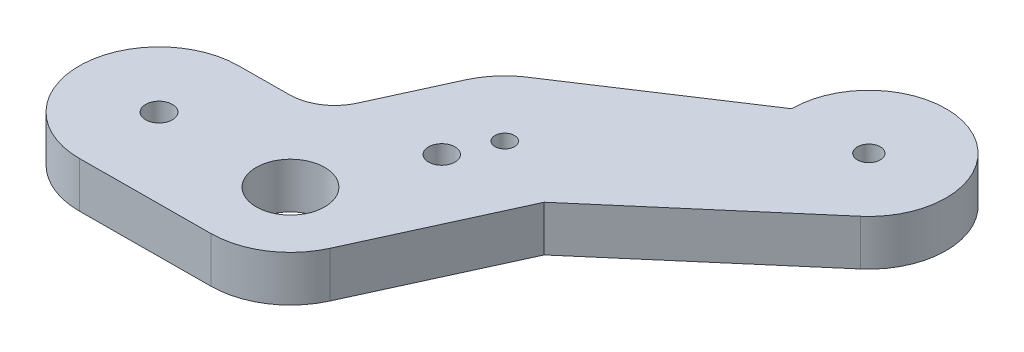
ISO-10303-21;
HEADER;
FILE_DESCRIPTION(('STEP AP214'),'2;1');
FILE_NAME('part.step','',(''),(''),'','','');
FILE_SCHEMA(('AUTOMOTIVE_DESIGN { 1 0 10303 214 1 1 1 1 }'));
ENDSEC;
DATA;
#1=APPLICATION_CONTEXT('core data for automotive mechanical design processes');
#2=APPLICATION_PROTOCOL_DEFINITION('international standard','automotive_design',2000,#1);
#3=PRODUCT_CONTEXT('',#1,'mechanical');
#4=PRODUCT('Part','Part','',(#3));
#5=PRODUCT_RELATED_PRODUCT_CATEGORY('part','',(#4));
#6=PRODUCT_DEFINITION_FORMATION('','',#4);
#7=PRODUCT_DEFINITION_CONTEXT('part definition',#1,'design');
#8=PRODUCT_DEFINITION('design','',#6,#7);
#9=PRODUCT_DEFINITION_SHAPE('','',#8);
#10=(LENGTH_UNIT() NAMED_UNIT(*) SI_UNIT(.MILLI.,.METRE.));
#11=(NAMED_UNIT(*) PLANE_ANGLE_UNIT() SI_UNIT($,.RADIAN.));
#12=(NAMED_UNIT(*) SI_UNIT($,.STERADIAN.) SOLID_ANGLE_UNIT());
#13=UNCERTAINTY_MEASURE_WITH_UNIT(LENGTH_MEASURE(1.E-05),#10,'distance_accuracy_value','');
#14=(GEOMETRIC_REPRESENTATION_CONTEXT(3) GLOBAL_UNCERTAINTY_ASSIGNED_CONTEXT((#13)) GLOBAL_UNIT_ASSIGNED_CONTEXT((#10,
#11,#12)) REPRESENTATION_CONTEXT('',''));
#15=CARTESIAN_POINT('',(0.,0.,0.));
#16=DIRECTION('',(0.,0.,1.));
#17=DIRECTION('',(1.,0.,0.));
#18=AXIS2_PLACEMENT_3D('',#15,#16,#17);
#19=CARTESIAN_POINT('',(-5.72459988362683,2.,0.0323685502486947));
#20=DIRECTION('',(0.,1.,0.));
#21=DIRECTION('',(0.,0.,1.));
#22=AXIS2_PLACEMENT_3D('',#19,#20,#21);
#23=PLANE('',#22);
#24=DIRECTION('',(0.415791867421865,0.,-0.909459797344467));
#25=VECTOR('',#24,1.);
#26=CARTESIAN_POINT('',(6.12746518713403,2.,-4.98490569374996));
#27=LINE('',#26,#25);
#28=CARTESIAN_POINT('',(3.18310929070563,2.,1.45527153597653));
#29=VERTEX_POINT('',#28);
#30=CARTESIAN_POINT('',(6.12746518713402,2.,-4.98490569374996));
#31=VERTEX_POINT('',#30);
#32=EDGE_CURVE('E153',#29,#31,#27,.T.);
#33=ORIENTED_EDGE('',*,*,#32,.T.);
#34=DIRECTION('',(0.759237589921315,0.,-0.650813553984913));
#35=VECTOR('',#34,1.);
#36=CARTESIAN_POINT('',(13.5833894470859,2.,-11.3760757705167));
#37=LINE('',#36,#35);
#38=CARTESIAN_POINT('',(13.5833894470859,2.,-11.3760757705167));
#39=VERTEX_POINT('',#38);
#40=EDGE_CURVE('E135',#31,#39,#37,.T.);
#41=ORIENTED_EDGE('',*,*,#40,.T.);
#42=CARTESIAN_POINT('',(11.3810751490046,2.,-13.9452905474468));
#43=DIRECTION('',(0.,1.,0.));
#44=DIRECTION('',(0.,0.,1.));
#45=AXIS2_PLACEMENT_3D('',#42,#43,#44);
#46=CIRCLE('',#45,3.3839404305527);
#47=CARTESIAN_POINT('',(7.99713471845192,2.,-13.9452905474468));
#48=VERTEX_POINT('',#47);
#49=EDGE_CURVE('E145',#39,#48,#46,.T.);
#50=ORIENTED_EDGE('',*,*,#49,.T.);
#51=DIRECTION('',(-0.835586663594744,0.,0.549358651176628));
#52=VECTOR('',#51,1.);
#53=CARTESIAN_POINT('',(7.99713471845192,2.,-13.9452905474468));
#54=LINE('',#53,#52);
#55=CARTESIAN_POINT('',(1.17427403814456,2.,-9.45958283596333));
#56=VERTEX_POINT('',#55);
#57=EDGE_CURVE('E142',#48,#56,#54,.T.);
#58=ORIENTED_EDGE('',*,*,#57,.T.);
#59=CARTESIAN_POINT('',(1.17427403814456,2.,-9.45958283596333));
#60=DIRECTION('',(-0.835586663594743,0.,0.549358651176629));
#61=VECTOR('',#60,1.);
#62=LINE('',#59,#61);
#63=CARTESIAN_POINT('',(0.873997954056209,2.,-9.26216553417717));
#64=VERTEX_POINT('',#63);
#65=EDGE_CURVE('E11',#56,#64,#62,.T.);
#66=ORIENTED_EDGE('',*,*,#65,.T.);
#67=CARTESIAN_POINT('',(2.94435589642839,2.,-6.44017722972649));
#68=DIRECTION('',(0.,1.,0.));
#69=DIRECTION('',(0.,0.,1.));
#70=AXIS2_PLACEMENT_3D('',#67,#68,#69);
#71=CIRCLE('',#70,3.5);
#72=CARTESIAN_POINT('',(-0.23875339427724,2.,-7.89544876570302));
#73=VERTEX_POINT('',#72);
#74=EDGE_CURVE('E275',#64,#73,#71,.T.);
#75=ORIENTED_EDGE('',*,*,#74,.T.);
#76=DIRECTION('',(-0.415791867421866,0.,0.909459797344466));
#77=VECTOR('',#76,1.);
#78=CARTESIAN_POINT('',(-1.72322244007623,2.,-4.64847588494993));
#79=LINE('',#78,#77);
#80=CARTESIAN_POINT('',(-1.72322244007623,2.,-4.64847588494993));
#81=VERTEX_POINT('',#80);
#82=EDGE_CURVE('E272',#73,#81,#79,.T.);
#83=ORIENTED_EDGE('',*,*,#82,.T.);
#84=CARTESIAN_POINT('',(-3.54214203476516,2.,-5.48005961979366));
#85=DIRECTION('',(0.,-1.,0.));
#86=DIRECTION('',(0.,0.,-1.));
#87=AXIS2_PLACEMENT_3D('',#84,#85,#86);
#88=CIRCLE('',#87,2.);
#89=CARTESIAN_POINT('',(-3.5308336347052,2.,-3.48009159002716));
#90=VERTEX_POINT('',#89);
#91=EDGE_CURVE('E269',#81,#90,#88,.T.);
#92=ORIENTED_EDGE('',*,*,#91,.T.);
#93=DIRECTION('',(-0.999984014883249,0.,0.00565420002998162));
#94=VECTOR('',#93,1.);
#95=CARTESIAN_POINT('',(-5.74438958373176,2.,-3.46757550184268));
#96=LINE('',#95,#94);
#97=CARTESIAN_POINT('',(-5.74438958373176,2.,-3.46757550184268));
#98=VERTEX_POINT('',#97);
#99=EDGE_CURVE('E211',#90,#98,#96,.T.);
#100=ORIENTED_EDGE('',*,*,#99,.T.);
#101=CARTESIAN_POINT('',(-5.72459988362683,2.,0.0323685502486947));
#102=DIRECTION('',(0.,1.,0.));
#103=DIRECTION('',(0.,0.,1.));
#104=AXIS2_PLACEMENT_3D('',#101,#102,#103);
#105=CIRCLE('',#104,3.5);
#106=CARTESIAN_POINT('',(-5.70481018352189,2.,3.53231260234007));
#107=VERTEX_POINT('',#106);
#108=EDGE_CURVE('E205',#98,#107,#105,.T.);
#109=ORIENTED_EDGE('',*,*,#108,.T.);
#110=DIRECTION('',(0.999984014883249,0.,-0.00565420002998246));
#111=VECTOR('',#110,1.);
#112=CARTESIAN_POINT('',(-5.70481018352189,2.,3.53231260234007));
#113=LINE('',#112,#111);
#114=CARTESIAN_POINT('',(0.0197897001049382,2.,3.49994405209137));
#115=VERTEX_POINT('',#114);
#116=EDGE_CURVE('E339',#107,#115,#113,.T.);
#117=ORIENTED_EDGE('',*,*,#116,.T.);
#118=CARTESIAN_POINT('',(0.,2.,0.));
#119=DIRECTION('',(0.,1.,0.));
#120=DIRECTION('',(0.,0.,1.));
#121=AXIS2_PLACEMENT_3D('',#118,#119,#120);
#122=CIRCLE('',#121,3.5);
#123=EDGE_CURVE('E337',#115,#29,#122,.T.);
#124=ORIENTED_EDGE('',*,*,#123,.T.);
#125=EDGE_LOOP('',(#33,#41,#50,#58,#66,#75,#83,#92,#100,#109,#117,#124));
#126=FACE_BOUND('',#125,.T.);
#127=CARTESIAN_POINT('',(2.07373006433971,2.,-4.55137824127935));
#128=DIRECTION('',(0.,1.,0.));
#129=DIRECTION('',(0.,0.,1.));
#130=AXIS2_PLACEMENT_3D('',#127,#128,#129);
#131=CIRCLE('',#130,0.579621875226505);
#132=CARTESIAN_POINT('',(2.07373006433971,2.,-3.97175636605285));
#133=VERTEX_POINT('',#132);
#134=EDGE_CURVE('E170',#133,#133,#131,.T.);
#135=ORIENTED_EDGE('',*,*,#134,.F.);
#136=EDGE_LOOP('',(#135));
#137=FACE_BOUND('',#136,.T.);
#138=CARTESIAN_POINT('',(2.94435589642839,2.,-6.44017722972649));
#139=DIRECTION('',(0.,1.,0.));
#140=DIRECTION('',(0.,0.,1.));
#141=AXIS2_PLACEMENT_3D('',#138,#139,#140);
#142=CIRCLE('',#141,0.425857630056519);
#143=CARTESIAN_POINT('',(2.94435589642839,2.,-6.01431959966997));
#144=VERTEX_POINT('',#143);
#145=EDGE_CURVE('E351',#144,#144,#142,.T.);
#146=ORIENTED_EDGE('',*,*,#145,.F.);
#147=EDGE_LOOP('',(#146));
#148=FACE_BOUND('',#147,.T.);
#149=CARTESIAN_POINT('',(0.,2.,0.));
#150=DIRECTION('',(0.,1.,0.));
#151=DIRECTION('',(0.,0.,1.));
#152=AXIS2_PLACEMENT_3D('',#149,#150,#151);
#153=CIRCLE('',#152,1.5);
#154=CARTESIAN_POINT('',(0.,2.,1.5));
#155=VERTEX_POINT('',#154);
#156=EDGE_CURVE('E266',#155,#155,#153,.T.);
#157=ORIENTED_EDGE('',*,*,#156,.F.);
#158=EDGE_LOOP('',(#157));
#159=FACE_BOUND('',#158,.T.);
#160=CARTESIAN_POINT('',(-5.72459988362683,2.,0.0323685502486947));
#161=DIRECTION('',(0.,1.,0.));
#162=DIRECTION('',(0.,0.,1.));
#163=AXIS2_PLACEMENT_3D('',#160,#161,#162);
#164=CIRCLE('',#163,0.586127488486837);
#165=CARTESIAN_POINT('',(-5.72459988362683,2.,0.618496038735532));
#166=VERTEX_POINT('',#165);
#167=EDGE_CURVE('E359',#166,#166,#164,.T.);
#168=ORIENTED_EDGE('',*,*,#167,.F.);
#169=EDGE_LOOP('',(#168));
#170=FACE_BOUND('',#169,.T.);
#171=CARTESIAN_POINT('',(11.3810751490046,2.,-13.9452905474468));
#172=DIRECTION('',(0.,1.,0.));
#173=DIRECTION('',(0.,0.,1.));
#174=AXIS2_PLACEMENT_3D('',#171,#172,#173);
#175=CIRCLE('',#174,0.499999999999995);
#176=CARTESIAN_POINT('',(11.3810751490046,2.,-13.4452905474468));
#177=VERTEX_POINT('',#176);
#178=EDGE_CURVE('E156',#177,#177,#175,.T.);
#179=ORIENTED_EDGE('',*,*,#178,.F.);
#180=EDGE_LOOP('',(#179));
#181=FACE_BOUND('',#180,.T.);
#182=ADVANCED_FACE('F39',(#126,#137,#148,#159,#170,#181),#23,.T.);
#183=CARTESIAN_POINT('',(-5.72459988362683,0.,0.0323685502486947));
#184=DIRECTION('',(0.,1.,0.));
#185=DIRECTION('',(0.,0.,1.));
#186=AXIS2_PLACEMENT_3D('',#183,#184,#185);
#187=PLANE('',#186);
#188=CARTESIAN_POINT('',(2.07373006433971,0.,-4.55137824127935));
#189=DIRECTION('',(0.,1.,0.));
#190=DIRECTION('',(0.,0.,1.));
#191=AXIS2_PLACEMENT_3D('',#188,#189,#190);
#192=CIRCLE('',#191,0.579621875226505);
#193=CARTESIAN_POINT('',(2.07373006433971,0.,-3.97175636605285));
#194=VERTEX_POINT('',#193);
#195=EDGE_CURVE('E367',#194,#194,#192,.F.);
#196=ORIENTED_EDGE('',*,*,#195,.F.);
#197=EDGE_LOOP('',(#196));
#198=FACE_BOUND('',#197,.T.);
#199=CARTESIAN_POINT('',(2.94435589642839,0.,-6.44017722972649));
#200=DIRECTION('',(0.,1.,0.));
#201=DIRECTION('',(0.,0.,1.));
#202=AXIS2_PLACEMENT_3D('',#199,#200,#201);
#203=CIRCLE('',#202,3.5);
#204=CARTESIAN_POINT('',(0.873997954056177,0.,-9.26216553417715));
#205=VERTEX_POINT('',#204);
#206=CARTESIAN_POINT('',(-0.23875339427724,0.,-7.89544876570302));
#207=VERTEX_POINT('',#206);
#208=EDGE_CURVE('E185',#205,#207,#203,.T.);
#209=ORIENTED_EDGE('',*,*,#208,.F.);
#210=CARTESIAN_POINT('',(2.94435589642839,0.,-6.44017722972649));
#211=DIRECTION('',(0.,1.,0.));
#212=DIRECTION('',(-0.505737673795381,0.,-0.862687316067668));
#213=AXIS2_PLACEMENT_3D('',#210,#211,#212);
#214=CIRCLE('',#213,3.5);
#215=CARTESIAN_POINT('',(1.17427403814456,0.,-9.45958283596333));
#216=VERTEX_POINT('',#215);
#217=EDGE_CURVE('E51',#216,#205,#214,.T.);
#218=ORIENTED_EDGE('',*,*,#217,.F.);
#219=DIRECTION('',(0.835586663594744,0.,-0.549358651176628));
#220=VECTOR('',#219,1.);
#221=CARTESIAN_POINT('',(7.99713471845192,0.,-13.9452905474468));
#222=LINE('',#221,#220);
#223=CARTESIAN_POINT('',(7.99713471845192,0.,-13.9452905474468));
#224=VERTEX_POINT('',#223);
#225=EDGE_CURVE('E173',#216,#224,#222,.T.);
#226=ORIENTED_EDGE('',*,*,#225,.T.);
#227=CARTESIAN_POINT('',(11.3810751490046,0.,-13.9452905474468));
#228=DIRECTION('',(0.,1.,0.));
#229=DIRECTION('',(0.,0.,1.));
#230=AXIS2_PLACEMENT_3D('',#227,#228,#229);
#231=CIRCLE('',#230,3.3839404305527);
#232=CARTESIAN_POINT('',(13.5833894470859,0.,-11.3760757705167));
#233=VERTEX_POINT('',#232);
#234=EDGE_CURVE('E164',#224,#233,#231,.F.);
#235=ORIENTED_EDGE('',*,*,#234,.T.);
#236=DIRECTION('',(-0.759237589921315,0.,0.650813553984913));
#237=VECTOR('',#236,1.);
#238=CARTESIAN_POINT('',(13.5833894470859,0.,-11.3760757705167));
#239=LINE('',#238,#237);
#240=CARTESIAN_POINT('',(6.12746518713402,0.,-4.98490569374996));
#241=VERTEX_POINT('',#240);
#242=EDGE_CURVE('E137',#233,#241,#239,.T.);
#243=ORIENTED_EDGE('',*,*,#242,.T.);
#244=DIRECTION('',(0.415791867421865,0.,-0.909459797344467));
#245=VECTOR('',#244,1.);
#246=CARTESIAN_POINT('',(6.12746518713403,0.,-4.98490569374996));
#247=LINE('',#246,#245);
#248=CARTESIAN_POINT('',(3.18310929070563,0.,1.45527153597653));
#249=VERTEX_POINT('',#248);
#250=EDGE_CURVE('E190',#249,#241,#247,.T.);
#251=ORIENTED_EDGE('',*,*,#250,.F.);
#252=CARTESIAN_POINT('',(0.,0.,0.));
#253=DIRECTION('',(0.,1.,0.));
#254=DIRECTION('',(0.,0.,1.));
#255=AXIS2_PLACEMENT_3D('',#252,#253,#254);
#256=CIRCLE('',#255,3.5);
#257=CARTESIAN_POINT('',(0.0197897001049382,0.,3.49994405209137));
#258=VERTEX_POINT('',#257);
#259=EDGE_CURVE('E255',#258,#249,#256,.T.);
#260=ORIENTED_EDGE('',*,*,#259,.F.);
#261=DIRECTION('',(0.999984014883249,0.,-0.00565420002998246));
#262=VECTOR('',#261,1.);
#263=CARTESIAN_POINT('',(-5.70481018352189,0.,3.53231260234007));
#264=LINE('',#263,#262);
#265=CARTESIAN_POINT('',(-5.70481018352189,0.,3.53231260234007));
#266=VERTEX_POINT('',#265);
#267=EDGE_CURVE('E257',#266,#258,#264,.T.);
#268=ORIENTED_EDGE('',*,*,#267,.F.);
#269=CARTESIAN_POINT('',(-5.72459988362683,0.,0.0323685502486947));
#270=DIRECTION('',(0.,1.,0.));
#271=DIRECTION('',(0.,0.,1.));
#272=AXIS2_PLACEMENT_3D('',#269,#270,#271);
#273=CIRCLE('',#272,3.5);
#274=CARTESIAN_POINT('',(-5.74438958373176,0.,-3.46757550184268));
#275=VERTEX_POINT('',#274);
#276=EDGE_CURVE('E260',#275,#266,#273,.T.);
#277=ORIENTED_EDGE('',*,*,#276,.F.);
#278=DIRECTION('',(-0.999984014883249,0.,0.00565420002998162));
#279=VECTOR('',#278,1.);
#280=CARTESIAN_POINT('',(-5.74438958373176,0.,-3.46757550184268));
#281=LINE('',#280,#279);
#282=CARTESIAN_POINT('',(-3.5308336347052,0.,-3.48009159002716));
#283=VERTEX_POINT('',#282);
#284=EDGE_CURVE('E202',#283,#275,#281,.T.);
#285=ORIENTED_EDGE('',*,*,#284,.F.);
#286=CARTESIAN_POINT('',(-3.54214203476516,0.,-5.48005961979366));
#287=DIRECTION('',(0.,-1.,0.));
#288=DIRECTION('',(0.,0.,-1.));
#289=AXIS2_PLACEMENT_3D('',#286,#287,#288);
#290=CIRCLE('',#289,2.);
#291=CARTESIAN_POINT('',(-1.72322244007623,0.,-4.64847588494993));
#292=VERTEX_POINT('',#291);
#293=EDGE_CURVE('E199',#292,#283,#290,.T.);
#294=ORIENTED_EDGE('',*,*,#293,.F.);
#295=DIRECTION('',(-0.415791867421866,0.,0.909459797344466));
#296=VECTOR('',#295,1.);
#297=CARTESIAN_POINT('',(-1.72322244007623,0.,-4.64847588494993));
#298=LINE('',#297,#296);
#299=EDGE_CURVE('E189',#207,#292,#298,.T.);
#300=ORIENTED_EDGE('',*,*,#299,.F.);
#301=EDGE_LOOP('',(#209,#218,#226,#235,#243,#251,#260,#268,#277,#285,#294,#300));
#302=FACE_BOUND('',#301,.T.);
#303=CARTESIAN_POINT('',(0.,0.,0.));
#304=DIRECTION('',(0.,1.,0.));
#305=DIRECTION('',(0.,0.,1.));
#306=AXIS2_PLACEMENT_3D('',#303,#304,#305);
#307=CIRCLE('',#306,1.5);
#308=CARTESIAN_POINT('',(0.,0.,1.5));
#309=VERTEX_POINT('',#308);
#310=EDGE_CURVE('E347',#309,#309,#307,.T.);
#311=ORIENTED_EDGE('',*,*,#310,.T.);
#312=EDGE_LOOP('',(#311));
#313=FACE_BOUND('',#312,.T.);
#314=CARTESIAN_POINT('',(2.94435589642839,0.,-6.44017722972649));
#315=DIRECTION('',(0.,1.,0.));
#316=DIRECTION('',(0.,0.,1.));
#317=AXIS2_PLACEMENT_3D('',#314,#315,#316);
#318=CIRCLE('',#317,0.425857630056519);
#319=CARTESIAN_POINT('',(2.94435589642839,0.,-6.01431959966997));
#320=VERTEX_POINT('',#319);
#321=EDGE_CURVE('E355',#320,#320,#318,.T.);
#322=ORIENTED_EDGE('',*,*,#321,.T.);
#323=EDGE_LOOP('',(#322));
#324=FACE_BOUND('',#323,.T.);
#325=CARTESIAN_POINT('',(-5.72459988362683,0.,0.0323685502486947));
#326=DIRECTION('',(0.,1.,0.));
#327=DIRECTION('',(0.,0.,1.));
#328=AXIS2_PLACEMENT_3D('',#325,#326,#327);
#329=CIRCLE('',#328,0.586127488486837);
#330=CARTESIAN_POINT('',(-5.72459988362683,0.,0.618496038735532));
#331=VERTEX_POINT('',#330);
#332=EDGE_CURVE('E363',#331,#331,#329,.T.);
#333=ORIENTED_EDGE('',*,*,#332,.T.);
#334=EDGE_LOOP('',(#333));
#335=FACE_BOUND('',#334,.T.);
#336=CARTESIAN_POINT('',(11.3810751490046,0.,-13.9452905474468));
#337=DIRECTION('',(0.,1.,0.));
#338=DIRECTION('',(0.,0.,1.));
#339=AXIS2_PLACEMENT_3D('',#336,#337,#338);
#340=CIRCLE('',#339,0.499999999999995);
#341=CARTESIAN_POINT('',(11.3810751490046,0.,-13.4452905474468));
#342=VERTEX_POINT('',#341);
#343=EDGE_CURVE('E166',#342,#342,#340,.F.);
#344=ORIENTED_EDGE('',*,*,#343,.F.);
#345=EDGE_LOOP('',(#344));
#346=FACE_BOUND('',#345,.T.);
#347=ADVANCED_FACE('F239',(#198,#302,#313,#324,#335,#346),#187,.F.);
#348=CARTESIAN_POINT('',(-5.72459988362683,2.,0.0323685502486947));
#349=DIRECTION('',(0.,-1.,0.));
#350=DIRECTION('',(0.,0.,-1.));
#351=AXIS2_PLACEMENT_3D('',#348,#349,#350);
#352=CYLINDRICAL_SURFACE('',#351,3.5);
#353=ORIENTED_EDGE('',*,*,#276,.T.);
#354=DIRECTION('',(0.,-1.,0.));
#355=VECTOR('',#354,1.);
#356=CARTESIAN_POINT('',(-5.70481018352189,2.,3.53231260234007));
#357=LINE('',#356,#355);
#358=EDGE_CURVE('E180',#107,#266,#357,.T.);
#359=ORIENTED_EDGE('',*,*,#358,.F.);
#360=ORIENTED_EDGE('',*,*,#108,.F.);
#361=DIRECTION('',(0.,-1.,0.));
#362=VECTOR('',#361,1.);
#363=CARTESIAN_POINT('',(-5.74438958373176,2.,-3.46757550184268));
#364=LINE('',#363,#362);
#365=EDGE_CURVE('E206',#98,#275,#364,.T.);
#366=ORIENTED_EDGE('',*,*,#365,.T.);
#367=EDGE_LOOP('',(#353,#359,#360,#366));
#368=FACE_BOUND('',#367,.T.);
#369=ADVANCED_FACE('F41',(#368),#352,.T.);
#370=CARTESIAN_POINT('',(-5.70481018352189,2.,3.53231260234007));
#371=DIRECTION('',(-0.00565420002998246,0.,-0.999984014883249));
#372=DIRECTION('',(-0.999984014883249,0.,0.00565420002998246));
#373=AXIS2_PLACEMENT_3D('',#370,#371,#372);
#374=PLANE('',#373);
#375=ORIENTED_EDGE('',*,*,#267,.T.);
#376=DIRECTION('',(0.,-1.,0.));
#377=VECTOR('',#376,1.);
#378=CARTESIAN_POINT('',(0.0197897001049382,2.,3.49994405209137));
#379=LINE('',#378,#377);
#380=EDGE_CURVE('E230',#115,#258,#379,.T.);
#381=ORIENTED_EDGE('',*,*,#380,.F.);
#382=ORIENTED_EDGE('',*,*,#116,.F.);
#383=ORIENTED_EDGE('',*,*,#358,.T.);
#384=EDGE_LOOP('',(#375,#381,#382,#383));
#385=FACE_BOUND('',#384,.T.);
#386=ADVANCED_FACE('F326',(#385),#374,.F.);
#387=CARTESIAN_POINT('',(0.,2.,0.));
#388=DIRECTION('',(0.,-1.,0.));
#389=DIRECTION('',(0.,0.,-1.));
#390=AXIS2_PLACEMENT_3D('',#387,#388,#389);
#391=CYLINDRICAL_SURFACE('',#390,3.5);
#392=ORIENTED_EDGE('',*,*,#259,.T.);
#393=DIRECTION('',(0.,-1.,0.));
#394=VECTOR('',#393,1.);
#395=CARTESIAN_POINT('',(3.18310929070563,2.,1.45527153597653));
#396=LINE('',#395,#394);
#397=EDGE_CURVE('E226',#29,#249,#396,.T.);
#398=ORIENTED_EDGE('',*,*,#397,.F.);
#399=ORIENTED_EDGE('',*,*,#123,.F.);
#400=ORIENTED_EDGE('',*,*,#380,.T.);
#401=EDGE_LOOP('',(#392,#398,#399,#400));
#402=FACE_BOUND('',#401,.T.);
#403=ADVANCED_FACE('F324',(#402),#391,.T.);
#404=CARTESIAN_POINT('',(6.12746518713403,2.,-4.98490569374996));
#405=DIRECTION('',(-0.909459797344467,0.,-0.415791867421865));
#406=DIRECTION('',(-0.415791867421865,0.,0.909459797344467));
#407=AXIS2_PLACEMENT_3D('',#404,#405,#406);
#408=PLANE('',#407);
#409=ORIENTED_EDGE('',*,*,#250,.T.);
#410=DIRECTION('',(0.,-1.,0.));
#411=VECTOR('',#410,1.);
#412=CARTESIAN_POINT('',(6.12746518713402,2.,-4.98490569374996));
#413=LINE('',#412,#411);
#414=EDGE_CURVE('E223',#31,#241,#413,.T.);
#415=ORIENTED_EDGE('',*,*,#414,.F.);
#416=ORIENTED_EDGE('',*,*,#32,.F.);
#417=ORIENTED_EDGE('',*,*,#397,.T.);
#418=EDGE_LOOP('',(#409,#415,#416,#417));
#419=FACE_BOUND('',#418,.T.);
#420=ADVANCED_FACE('F252',(#419),#408,.F.);
#421=CARTESIAN_POINT('',(2.94435589642839,2.,-6.44017722972649));
#422=DIRECTION('',(0.,-1.,0.));
#423=DIRECTION('',(0.,0.,-1.));
#424=AXIS2_PLACEMENT_3D('',#421,#422,#423);
#425=CYLINDRICAL_SURFACE('',#424,3.5);
#426=ORIENTED_EDGE('',*,*,#74,.F.);
#427=ORIENTED_EDGE('',*,*,#65,.F.);
#428=DIRECTION('',(0.,-1.,0.));
#429=VECTOR('',#428,1.);
#430=CARTESIAN_POINT('',(1.17427403814457,2.,-9.45958283596334));
#431=LINE('',#430,#429);
#432=EDGE_CURVE('E176',#56,#216,#431,.T.);
#433=ORIENTED_EDGE('',*,*,#432,.T.);
#434=ORIENTED_EDGE('',*,*,#217,.T.);
#435=ORIENTED_EDGE('',*,*,#208,.T.);
#436=DIRECTION('',(0.,-1.,0.));
#437=VECTOR('',#436,1.);
#438=CARTESIAN_POINT('',(-0.23875339427724,2.,-7.89544876570302));
#439=LINE('',#438,#437);
#440=EDGE_CURVE('E219',#73,#207,#439,.T.);
#441=ORIENTED_EDGE('',*,*,#440,.F.);
#442=EDGE_LOOP('',(#426,#427,#433,#434,#435,#441));
#443=FACE_BOUND('',#442,.T.);
#444=ADVANCED_FACE('F309',(#443),#425,.T.);
#445=CARTESIAN_POINT('',(-1.72322244007623,2.,-4.64847588494993));
#446=DIRECTION('',(0.909459797344466,0.,0.415791867421866));
#447=DIRECTION('',(0.415791867421866,0.,-0.909459797344466));
#448=AXIS2_PLACEMENT_3D('',#445,#446,#447);
#449=PLANE('',#448);
#450=ORIENTED_EDGE('',*,*,#299,.T.);
#451=DIRECTION('',(0.,-1.,0.));
#452=VECTOR('',#451,1.);
#453=CARTESIAN_POINT('',(-1.72322244007623,2.,-4.64847588494993));
#454=LINE('',#453,#452);
#455=EDGE_CURVE('E215',#81,#292,#454,.T.);
#456=ORIENTED_EDGE('',*,*,#455,.F.);
#457=ORIENTED_EDGE('',*,*,#82,.F.);
#458=ORIENTED_EDGE('',*,*,#440,.T.);
#459=EDGE_LOOP('',(#450,#456,#457,#458));
#460=FACE_BOUND('',#459,.T.);
#461=ADVANCED_FACE('F306',(#460),#449,.F.);
#462=CARTESIAN_POINT('',(-3.54214203476516,2.,-5.48005961979366));
#463=DIRECTION('',(0.,-1.,0.));
#464=DIRECTION('',(0.,0.,-1.));
#465=AXIS2_PLACEMENT_3D('',#462,#463,#464);
#466=CYLINDRICAL_SURFACE('',#465,2.);
#467=ORIENTED_EDGE('',*,*,#293,.T.);
#468=DIRECTION('',(0.,-1.,0.));
#469=VECTOR('',#468,1.);
#470=CARTESIAN_POINT('',(-3.5308336347052,2.,-3.48009159002716));
#471=LINE('',#470,#469);
#472=EDGE_CURVE('E210',#90,#283,#471,.T.);
#473=ORIENTED_EDGE('',*,*,#472,.F.);
#474=ORIENTED_EDGE('',*,*,#91,.F.);
#475=ORIENTED_EDGE('',*,*,#455,.T.);
#476=EDGE_LOOP('',(#467,#473,#474,#475));
#477=FACE_BOUND('',#476,.T.);
#478=ADVANCED_FACE('F302',(#477),#466,.F.);
#479=CARTESIAN_POINT('',(-5.74438958373176,2.,-3.46757550184268));
#480=DIRECTION('',(0.00565420002998162,0.,0.999984014883249));
#481=DIRECTION('',(0.999984014883249,0.,-0.00565420002998162));
#482=AXIS2_PLACEMENT_3D('',#479,#480,#481);
#483=PLANE('',#482);
#484=ORIENTED_EDGE('',*,*,#284,.T.);
#485=ORIENTED_EDGE('',*,*,#365,.F.);
#486=ORIENTED_EDGE('',*,*,#99,.F.);
#487=ORIENTED_EDGE('',*,*,#472,.T.);
#488=EDGE_LOOP('',(#484,#485,#486,#487));
#489=FACE_BOUND('',#488,.T.);
#490=ADVANCED_FACE('F299',(#489),#483,.F.);
#491=CARTESIAN_POINT('',(0.,2.,0.));
#492=DIRECTION('',(0.,-1.,0.));
#493=DIRECTION('',(0.,0.,-1.));
#494=AXIS2_PLACEMENT_3D('',#491,#492,#493);
#495=CYLINDRICAL_SURFACE('',#494,1.5);
#496=ORIENTED_EDGE('',*,*,#156,.T.);
#497=EDGE_LOOP('',(#496));
#498=FACE_BOUND('',#497,.T.);
#499=ORIENTED_EDGE('',*,*,#310,.F.);
#500=EDGE_LOOP('',(#499));
#501=FACE_BOUND('',#500,.T.);
#502=ADVANCED_FACE('F293',(#498,#501),#495,.F.);
#503=CARTESIAN_POINT('',(2.94435589642839,2.,-6.44017722972649));
#504=DIRECTION('',(0.,-1.,0.));
#505=DIRECTION('',(0.,0.,-1.));
#506=AXIS2_PLACEMENT_3D('',#503,#504,#505);
#507=CYLINDRICAL_SURFACE('',#506,0.425857630056519);
#508=ORIENTED_EDGE('',*,*,#145,.T.);
#509=EDGE_LOOP('',(#508));
#510=FACE_BOUND('',#509,.T.);
#511=ORIENTED_EDGE('',*,*,#321,.F.);
#512=EDGE_LOOP('',(#511));
#513=FACE_BOUND('',#512,.T.);
#514=ADVANCED_FACE('F411',(#510,#513),#507,.F.);
#515=CARTESIAN_POINT('',(-5.72459988362683,2.,0.0323685502486947));
#516=DIRECTION('',(0.,-1.,0.));
#517=DIRECTION('',(0.,0.,-1.));
#518=AXIS2_PLACEMENT_3D('',#515,#516,#517);
#519=CYLINDRICAL_SURFACE('',#518,0.586127488486837);
#520=ORIENTED_EDGE('',*,*,#167,.T.);
#521=EDGE_LOOP('',(#520));
#522=FACE_BOUND('',#521,.T.);
#523=ORIENTED_EDGE('',*,*,#332,.F.);
#524=EDGE_LOOP('',(#523));
#525=FACE_BOUND('',#524,.T.);
#526=ADVANCED_FACE('F408',(#522,#525),#519,.F.);
#527=CARTESIAN_POINT('',(2.07373006433971,-1.6394182339869,-4.55137824127935));
#528=DIRECTION('',(0.,1.,0.));
#529=DIRECTION('',(0.,0.,1.));
#530=AXIS2_PLACEMENT_3D('',#527,#528,#529);
#531=CYLINDRICAL_SURFACE('',#530,0.579621875226505);
#532=ORIENTED_EDGE('',*,*,#195,.T.);
#533=EDGE_LOOP('',(#532));
#534=FACE_BOUND('',#533,.T.);
#535=ORIENTED_EDGE('',*,*,#134,.T.);
#536=EDGE_LOOP('',(#535));
#537=FACE_BOUND('',#536,.T.);
#538=ADVANCED_FACE('F383',(#534,#537),#531,.F.);
#539=CARTESIAN_POINT('',(7.99713471845192,-18.5833995112666,-13.9452905474468));
#540=DIRECTION('',(-0.549358651176628,0.,-0.835586663594744));
#541=DIRECTION('',(-0.835586663594744,0.,0.549358651176628));
#542=AXIS2_PLACEMENT_3D('',#539,#540,#541);
#543=PLANE('',#542);
#544=ORIENTED_EDGE('',*,*,#432,.F.);
#545=ORIENTED_EDGE('',*,*,#57,.F.);
#546=DIRECTION('',(0.,1.,0.));
#547=VECTOR('',#546,1.);
#548=CARTESIAN_POINT('',(7.99713471845192,-18.5833995112666,-13.9452905474468));
#549=LINE('',#548,#547);
#550=EDGE_CURVE('E141',#224,#48,#549,.T.);
#551=ORIENTED_EDGE('',*,*,#550,.F.);
#552=ORIENTED_EDGE('',*,*,#225,.F.);
#553=EDGE_LOOP('',(#544,#545,#551,#552));
#554=FACE_BOUND('',#553,.T.);
#555=ADVANCED_FACE('F244',(#554),#543,.T.);
#556=CARTESIAN_POINT('',(13.5833894470859,-18.5833995112666,-11.3760757705167));
#557=DIRECTION('',(0.650813553984913,0.,0.759237589921315));
#558=DIRECTION('',(0.759237589921315,0.,-0.650813553984913));
#559=AXIS2_PLACEMENT_3D('',#556,#557,#558);
#560=PLANE('',#559);
#561=ORIENTED_EDGE('',*,*,#242,.F.);
#562=DIRECTION('',(0.,1.,0.));
#563=VECTOR('',#562,1.);
#564=CARTESIAN_POINT('',(13.5833894470859,-18.5833995112666,-11.3760757705167));
#565=LINE('',#564,#563);
#566=EDGE_CURVE('E130',#233,#39,#565,.T.);
#567=ORIENTED_EDGE('',*,*,#566,.T.);
#568=ORIENTED_EDGE('',*,*,#40,.F.);
#569=ORIENTED_EDGE('',*,*,#414,.T.);
#570=EDGE_LOOP('',(#561,#567,#568,#569));
#571=FACE_BOUND('',#570,.T.);
#572=ADVANCED_FACE('F132',(#571),#560,.T.);
#573=CARTESIAN_POINT('',(11.3810751490046,-18.5833995112666,-13.9452905474468));
#574=DIRECTION('',(0.,1.,0.));
#575=DIRECTION('',(0.,0.,1.));
#576=AXIS2_PLACEMENT_3D('',#573,#574,#575);
#577=CYLINDRICAL_SURFACE('',#576,3.3839404305527);
#578=ORIENTED_EDGE('',*,*,#234,.F.);
#579=ORIENTED_EDGE('',*,*,#550,.T.);
#580=ORIENTED_EDGE('',*,*,#49,.F.);
#581=ORIENTED_EDGE('',*,*,#566,.F.);
#582=EDGE_LOOP('',(#578,#579,#580,#581));
#583=FACE_BOUND('',#582,.T.);
#584=ADVANCED_FACE('F146',(#583),#577,.T.);
#585=CARTESIAN_POINT('',(11.3810751490046,-18.5833995112666,-13.9452905474468));
#586=DIRECTION('',(0.,1.,0.));
#587=DIRECTION('',(0.,0.,1.));
#588=AXIS2_PLACEMENT_3D('',#585,#586,#587);
#589=CYLINDRICAL_SURFACE('',#588,0.499999999999995);
#590=ORIENTED_EDGE('',*,*,#343,.T.);
#591=EDGE_LOOP('',(#590));
#592=FACE_BOUND('',#591,.T.);
#593=ORIENTED_EDGE('',*,*,#178,.T.);
#594=EDGE_LOOP('',(#593));
#595=FACE_BOUND('',#594,.T.);
#596=ADVANCED_FACE('F393',(#592,#595),#589,.F.);
#597=CLOSED_SHELL('',(#182,#347,#369,#386,#403,#420,#444,#461,#478,#490,#502,#514,#526,#538,
#555,#572,#584,#596));
#598=MANIFOLD_SOLID_BREP('B2',#597);
#599=ADVANCED_BREP_SHAPE_REPRESENTATION('',(#18,#598),#14);
#600=SHAPE_DEFINITION_REPRESENTATION(#9,#599);
ENDSEC;
END-ISO-10303-21;
